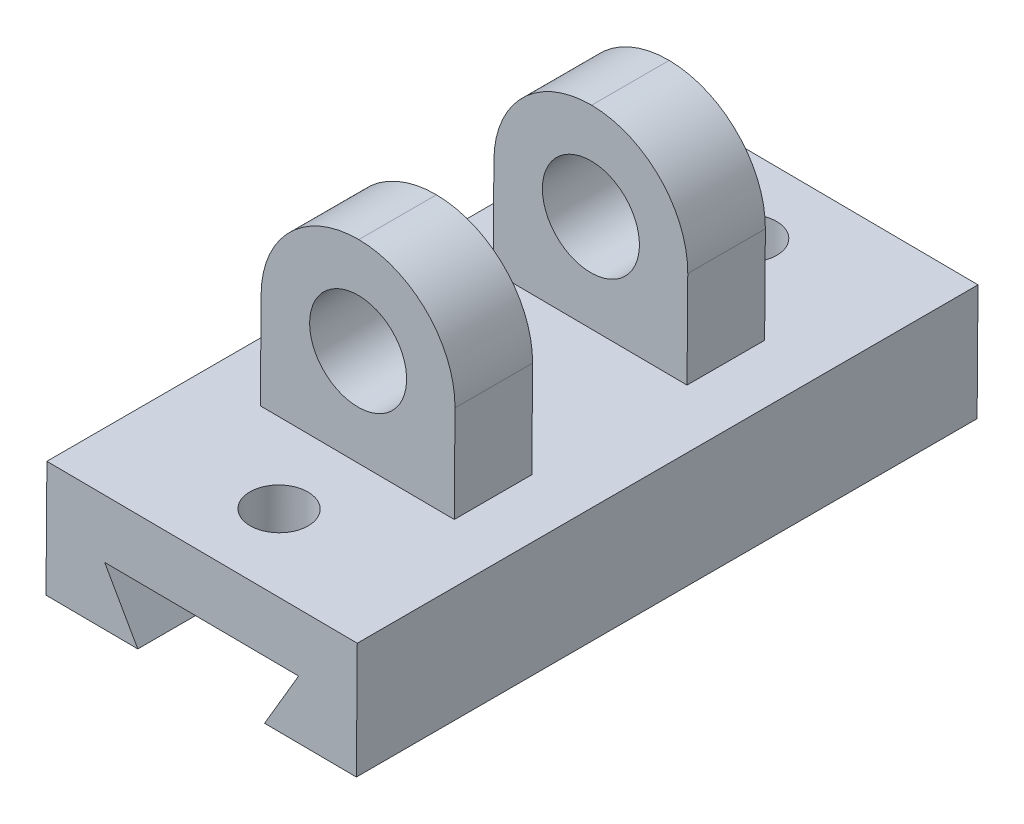
ISO-10303-21;
HEADER;
FILE_DESCRIPTION(('STEP AP214'),'2;1');
FILE_NAME('part.step','',(''),(''),'','','');
FILE_SCHEMA(('AUTOMOTIVE_DESIGN { 1 0 10303 214 1 1 1 1 }'));
ENDSEC;
DATA;
#1=APPLICATION_CONTEXT('core data for automotive mechanical design processes');
#2=APPLICATION_PROTOCOL_DEFINITION('international standard','automotive_design',2000,#1);
#3=PRODUCT_CONTEXT('',#1,'mechanical');
#4=PRODUCT('Part','Part','',(#3));
#5=PRODUCT_RELATED_PRODUCT_CATEGORY('part','',(#4));
#6=PRODUCT_DEFINITION_FORMATION('','',#4);
#7=PRODUCT_DEFINITION_CONTEXT('part definition',#1,'design');
#8=PRODUCT_DEFINITION('design','',#6,#7);
#9=PRODUCT_DEFINITION_SHAPE('','',#8);
#10=(LENGTH_UNIT() NAMED_UNIT(*) SI_UNIT(.MILLI.,.METRE.));
#11=(NAMED_UNIT(*) PLANE_ANGLE_UNIT() SI_UNIT($,.RADIAN.));
#12=(NAMED_UNIT(*) SI_UNIT($,.STERADIAN.) SOLID_ANGLE_UNIT());
#13=UNCERTAINTY_MEASURE_WITH_UNIT(LENGTH_MEASURE(1.E-05),#10,'distance_accuracy_value','');
#14=(GEOMETRIC_REPRESENTATION_CONTEXT(3) GLOBAL_UNCERTAINTY_ASSIGNED_CONTEXT((#13)) GLOBAL_UNIT_ASSIGNED_CONTEXT((#10,
#11,#12)) REPRESENTATION_CONTEXT('',''));
#15=CARTESIAN_POINT('',(0.,0.,0.));
#16=DIRECTION('',(0.,0.,1.));
#17=DIRECTION('',(1.,0.,0.));
#18=AXIS2_PLACEMENT_3D('',#15,#16,#17);
#19=CARTESIAN_POINT('',(-46.1272662721142,8.0110648260031,-160.));
#20=DIRECTION('',(0.00763777532237596,0.99997083176867,0.));
#21=DIRECTION('',(-0.99997083176867,0.00763777532237596,0.));
#22=AXIS2_PLACEMENT_3D('',#19,#20,#21);
#23=PLANE('',#22);
#24=DIRECTION('',(0.99997083176867,-0.00763777532237597,0.));
#25=VECTOR('',#24,1.);
#26=CARTESIAN_POINT('',(-31.0983660773324,7.89627411473093,-40.));
#27=LINE('',#26,#25);
#28=CARTESIAN_POINT('',(-31.0983660773324,7.89627411473093,-40.));
#29=VERTEX_POINT('',#28);
#30=CARTESIAN_POINT('',(18.8731712513557,7.514591607097,-40.));
#31=VERTEX_POINT('',#30);
#32=EDGE_CURVE('E189',#29,#31,#27,.T.);
#33=ORIENTED_EDGE('',*,*,#32,.F.);
#34=DIRECTION('',(0.,0.,1.));
#35=VECTOR('',#34,1.);
#36=CARTESIAN_POINT('',(-31.0983660773324,7.89627411473093,-60.));
#37=LINE('',#36,#35);
#38=CARTESIAN_POINT('',(-31.0983660773324,7.89627411473093,-60.));
#39=VERTEX_POINT('',#38);
#40=EDGE_CURVE('E162',#39,#29,#37,.T.);
#41=ORIENTED_EDGE('',*,*,#40,.F.);
#42=DIRECTION('',(-0.99997083176867,0.00763777532237597,0.));
#43=VECTOR('',#42,1.);
#44=CARTESIAN_POINT('',(-31.0983660773324,7.89627411473093,-60.));
#45=LINE('',#44,#43);
#46=CARTESIAN_POINT('',(18.8731712513555,7.514591607097,-60.));
#47=VERTEX_POINT('',#46);
#48=EDGE_CURVE('E195',#47,#39,#45,.T.);
#49=ORIENTED_EDGE('',*,*,#48,.F.);
#50=DIRECTION('',(0.,0.,-1.));
#51=VECTOR('',#50,1.);
#52=CARTESIAN_POINT('',(18.8731712513557,7.514591607097,-60.));
#53=LINE('',#52,#51);
#54=EDGE_CURVE('E192',#31,#47,#53,.T.);
#55=ORIENTED_EDGE('',*,*,#54,.F.);
#56=EDGE_LOOP('',(#33,#41,#49,#55));
#57=FACE_BOUND('',#56,.T.);
#58=CARTESIAN_POINT('',(-5.89384717139153,7.70376204698225,-19.602368066387));
#59=DIRECTION('',(0.00763777532237596,0.99997083176867,0.));
#60=DIRECTION('',(-0.99997083176867,0.00763777532237596,0.));
#61=AXIS2_PLACEMENT_3D('',#58,#59,#60);
#62=CIRCLE('',#61,7.5);
#63=CARTESIAN_POINT('',(-13.3936284096565,7.76104536190007,-19.602368066387));
#64=VERTEX_POINT('',#63);
#65=EDGE_CURVE('E206',#64,#64,#62,.T.);
#66=ORIENTED_EDGE('',*,*,#65,.F.);
#67=EDGE_LOOP('',(#66));
#68=FACE_BOUND('',#67,.T.);
#69=DIRECTION('',(-0.99997083176867,0.00763777532237596,0.));
#70=VECTOR('',#69,1.);
#71=CARTESIAN_POINT('',(-46.1272662721142,8.0110648260031,0.));
#72=LINE('',#71,#70);
#73=CARTESIAN_POINT('',(33.8727337278858,7.40002497726136,0.));
#74=VERTEX_POINT('',#73);
#75=CARTESIAN_POINT('',(-46.1272662721142,8.0110648260031,0.));
#76=VERTEX_POINT('',#75);
#77=EDGE_CURVE('E218',#74,#76,#72,.T.);
#78=ORIENTED_EDGE('',*,*,#77,.F.);
#79=DIRECTION('',(0.,0.,1.));
#80=VECTOR('',#79,1.);
#81=CARTESIAN_POINT('',(33.8727337278858,7.40002497726136,-160.));
#82=LINE('',#81,#80);
#83=CARTESIAN_POINT('',(33.8727337278858,7.40002497726136,-160.));
#84=VERTEX_POINT('',#83);
#85=EDGE_CURVE('E266',#84,#74,#82,.T.);
#86=ORIENTED_EDGE('',*,*,#85,.F.);
#87=DIRECTION('',(-0.99997083176867,0.00763777532237596,0.));
#88=VECTOR('',#87,1.);
#89=CARTESIAN_POINT('',(-46.1272662721142,8.0110648260031,-160.));
#90=LINE('',#89,#88);
#91=CARTESIAN_POINT('',(-46.1272662721142,8.0110648260031,-160.));
#92=VERTEX_POINT('',#91);
#93=EDGE_CURVE('E236',#84,#92,#90,.T.);
#94=ORIENTED_EDGE('',*,*,#93,.T.);
#95=DIRECTION('',(0.,0.,1.));
#96=VECTOR('',#95,1.);
#97=CARTESIAN_POINT('',(-46.1272662721142,8.0110648260031,-160.));
#98=LINE('',#97,#96);
#99=EDGE_CURVE('E263',#92,#76,#98,.T.);
#100=ORIENTED_EDGE('',*,*,#99,.T.);
#101=EDGE_LOOP('',(#78,#86,#94,#100));
#102=FACE_BOUND('',#101,.T.);
#103=CARTESIAN_POINT('',(-5.89384717139153,7.70376204698225,-140.397631933613));
#104=DIRECTION('',(-0.00763777532237596,-0.99997083176867,0.));
#105=DIRECTION('',(0.99997083176867,-0.00763777532237596,0.));
#106=AXIS2_PLACEMENT_3D('',#103,#104,#105);
#107=CIRCLE('',#106,7.5);
#108=CARTESIAN_POINT('',(-13.3936284096565,7.76104536190007,-140.397631933613));
#109=VERTEX_POINT('',#108);
#110=EDGE_CURVE('E210',#109,#109,#107,.T.);
#111=ORIENTED_EDGE('',*,*,#110,.T.);
#112=EDGE_LOOP('',(#111));
#113=FACE_BOUND('',#112,.T.);
#114=DIRECTION('',(0.,0.,-1.));
#115=VECTOR('',#114,1.);
#116=CARTESIAN_POINT('',(18.8731712513557,7.514591607097,-100.));
#117=LINE('',#116,#115);
#118=CARTESIAN_POINT('',(18.8731712513557,7.514591607097,-100.));
#119=VERTEX_POINT('',#118);
#120=CARTESIAN_POINT('',(18.8731712513557,7.514591607097,-120.));
#121=VERTEX_POINT('',#120);
#122=EDGE_CURVE('E158',#119,#121,#117,.T.);
#123=ORIENTED_EDGE('',*,*,#122,.F.);
#124=DIRECTION('',(0.99997083176867,-0.00763777532237597,0.));
#125=VECTOR('',#124,1.);
#126=CARTESIAN_POINT('',(-31.0983660773324,7.89627411473093,-100.));
#127=LINE('',#126,#125);
#128=CARTESIAN_POINT('',(-31.0983660773324,7.89627411473093,-100.));
#129=VERTEX_POINT('',#128);
#130=EDGE_CURVE('E166',#129,#119,#127,.T.);
#131=ORIENTED_EDGE('',*,*,#130,.F.);
#132=DIRECTION('',(0.,0.,1.));
#133=VECTOR('',#132,1.);
#134=CARTESIAN_POINT('',(-31.0983660773324,7.89627411473093,-100.));
#135=LINE('',#134,#133);
#136=CARTESIAN_POINT('',(-31.0983660773324,7.89627411473092,-120.));
#137=VERTEX_POINT('',#136);
#138=EDGE_CURVE('E178',#137,#129,#135,.T.);
#139=ORIENTED_EDGE('',*,*,#138,.F.);
#140=DIRECTION('',(-0.99997083176867,0.00763777532237597,0.));
#141=VECTOR('',#140,1.);
#142=CARTESIAN_POINT('',(-31.0983660773324,7.89627411473093,-120.));
#143=LINE('',#142,#141);
#144=EDGE_CURVE('E176',#121,#137,#143,.T.);
#145=ORIENTED_EDGE('',*,*,#144,.F.);
#146=EDGE_LOOP('',(#123,#131,#139,#145));
#147=FACE_BOUND('',#146,.T.);
#148=ADVANCED_FACE('F33',(#57,#68,#102,#113,#147),#23,.T.);
#149=CARTESIAN_POINT('',(-31.2422704254198,-7.10306428036258,-160.));
#150=DIRECTION('',(-0.00763777532237572,-0.99997083176867,0.));
#151=DIRECTION('',(0.99997083176867,-0.00763777532237572,0.));
#152=AXIS2_PLACEMENT_3D('',#149,#150,#151);
#153=PLANE('',#152);
#154=CARTESIAN_POINT('',(-6.00841380122716,-7.29580042954778,-19.602368066387));
#155=DIRECTION('',(-0.00763777532237572,-0.99997083176867,0.));
#156=DIRECTION('',(0.99997083176867,-0.00763777532237572,0.));
#157=AXIS2_PLACEMENT_3D('',#154,#155,#156);
#158=CIRCLE('',#157,7.5);
#159=CARTESIAN_POINT('',(-13.5081950394922,-7.23851711462997,-19.602368066387));
#160=VERTEX_POINT('',#159);
#161=EDGE_CURVE('E209',#160,#160,#158,.T.);
#162=ORIENTED_EDGE('',*,*,#161,.F.);
#163=EDGE_LOOP('',(#162));
#164=FACE_BOUND('',#163,.T.);
#165=DIRECTION('',(0.99997083176867,-0.00763777532237572,0.));
#166=VECTOR('',#165,1.);
#167=CARTESIAN_POINT('',(-31.2422704254198,-7.10306428036258,0.));
#168=LINE('',#167,#166);
#169=CARTESIAN_POINT('',(-31.2422704254198,-7.10306428036258,0.));
#170=VERTEX_POINT('',#169);
#171=CARTESIAN_POINT('',(18.7586046215201,-7.48497086943303,0.));
#172=VERTEX_POINT('',#171);
#173=EDGE_CURVE('E249',#170,#172,#168,.T.);
#174=ORIENTED_EDGE('',*,*,#173,.F.);
#175=DIRECTION('',(0.,0.,1.));
#176=VECTOR('',#175,1.);
#177=CARTESIAN_POINT('',(-31.2422704254198,-7.10306428036258,-160.));
#178=LINE('',#177,#176);
#179=CARTESIAN_POINT('',(-31.2422704254198,-7.10306428036258,-160.));
#180=VERTEX_POINT('',#179);
#181=EDGE_CURVE('E274',#180,#170,#178,.T.);
#182=ORIENTED_EDGE('',*,*,#181,.F.);
#183=DIRECTION('',(0.99997083176867,-0.00763777532237572,0.));
#184=VECTOR('',#183,1.);
#185=CARTESIAN_POINT('',(-31.2422704254198,-7.10306428036258,-160.));
#186=LINE('',#185,#184);
#187=CARTESIAN_POINT('',(18.7586046215201,-7.48497086943303,-160.));
#188=VERTEX_POINT('',#187);
#189=EDGE_CURVE('E224',#180,#188,#186,.T.);
#190=ORIENTED_EDGE('',*,*,#189,.T.);
#191=DIRECTION('',(0.,0.,1.));
#192=VECTOR('',#191,1.);
#193=CARTESIAN_POINT('',(18.7586046215201,-7.48497086943303,-160.));
#194=LINE('',#193,#192);
#195=EDGE_CURVE('E272',#188,#172,#194,.T.);
#196=ORIENTED_EDGE('',*,*,#195,.T.);
#197=EDGE_LOOP('',(#174,#182,#190,#196));
#198=FACE_BOUND('',#197,.T.);
#199=CARTESIAN_POINT('',(-6.00841380122716,-7.29580042954778,-140.397631933613));
#200=DIRECTION('',(-0.00763777532237572,-0.99997083176867,0.));
#201=DIRECTION('',(0.99997083176867,-0.00763777532237572,0.));
#202=AXIS2_PLACEMENT_3D('',#199,#200,#201);
#203=CIRCLE('',#202,7.5);
#204=CARTESIAN_POINT('',(-13.5081950394922,-7.23851711462997,-140.397631933613));
#205=VERTEX_POINT('',#204);
#206=EDGE_CURVE('E213',#205,#205,#203,.F.);
#207=ORIENTED_EDGE('',*,*,#206,.T.);
#208=EDGE_LOOP('',(#207));
#209=FACE_BOUND('',#208,.T.);
#210=ADVANCED_FACE('F332',(#164,#198,#209),#153,.T.);
#211=CARTESIAN_POINT('',(-46.1272662721142,8.0110648260031,-160.));
#212=DIRECTION('',(-0.99997083176867,0.0076377753223759,0.));
#213=DIRECTION('',(-0.0076377753223759,-0.99997083176867,0.));
#214=AXIS2_PLACEMENT_3D('',#211,#212,#213);
#215=PLANE('',#214);
#216=DIRECTION('',(-0.0076377753223759,-0.99997083176867,0.));
#217=VECTOR('',#216,1.);
#218=CARTESIAN_POINT('',(-46.1272662721142,8.0110648260031,0.));
#219=LINE('',#218,#217);
#220=CARTESIAN_POINT('',(-46.3563995317855,-21.988060127057,0.));
#221=VERTEX_POINT('',#220);
#222=EDGE_CURVE('E240',#76,#221,#219,.T.);
#223=ORIENTED_EDGE('',*,*,#222,.F.);
#224=ORIENTED_EDGE('',*,*,#99,.F.);
#225=DIRECTION('',(-0.0076377753223759,-0.99997083176867,0.));
#226=VECTOR('',#225,1.);
#227=CARTESIAN_POINT('',(-46.1272662721142,8.0110648260031,-160.));
#228=LINE('',#227,#226);
#229=CARTESIAN_POINT('',(-46.3563995317855,-21.988060127057,-160.));
#230=VERTEX_POINT('',#229);
#231=EDGE_CURVE('E214',#92,#230,#228,.T.);
#232=ORIENTED_EDGE('',*,*,#231,.T.);
#233=DIRECTION('',(0.,0.,1.));
#234=VECTOR('',#233,1.);
#235=CARTESIAN_POINT('',(-46.3563995317855,-21.988060127057,-160.));
#236=LINE('',#235,#234);
#237=EDGE_CURVE('E239',#230,#221,#236,.T.);
#238=ORIENTED_EDGE('',*,*,#237,.T.);
#239=EDGE_LOOP('',(#223,#224,#232,#238));
#240=FACE_BOUND('',#239,.T.);
#241=ADVANCED_FACE('F338',(#240),#215,.T.);
#242=CARTESIAN_POINT('',(33.8727337278858,7.40002497726136,-160.));
#243=DIRECTION('',(0.99997083176867,-0.00763777532237544,0.));
#244=DIRECTION('',(0.00763777532237544,0.99997083176867,0.));
#245=AXIS2_PLACEMENT_3D('',#242,#243,#244);
#246=PLANE('',#245);
#247=DIRECTION('',(0.00763777532237544,0.99997083176867,0.));
#248=VECTOR('',#247,1.);
#249=CARTESIAN_POINT('',(33.8727337278858,7.40002497726136,0.));
#250=LINE('',#249,#248);
#251=CARTESIAN_POINT('',(33.6436004682145,-22.5990999757987,0.));
#252=VERTEX_POINT('',#251);
#253=EDGE_CURVE('E258',#252,#74,#250,.T.);
#254=ORIENTED_EDGE('',*,*,#253,.F.);
#255=DIRECTION('',(0.,0.,1.));
#256=VECTOR('',#255,1.);
#257=CARTESIAN_POINT('',(33.6436004682145,-22.5990999757987,-160.));
#258=LINE('',#257,#256);
#259=CARTESIAN_POINT('',(33.6436004682145,-22.5990999757987,-160.));
#260=VERTEX_POINT('',#259);
#261=EDGE_CURVE('E268',#260,#252,#258,.T.);
#262=ORIENTED_EDGE('',*,*,#261,.F.);
#263=DIRECTION('',(0.00763777532237544,0.99997083176867,0.));
#264=VECTOR('',#263,1.);
#265=CARTESIAN_POINT('',(33.8727337278858,7.40002497726136,-160.));
#266=LINE('',#265,#264);
#267=EDGE_CURVE('E233',#260,#84,#266,.T.);
#268=ORIENTED_EDGE('',*,*,#267,.T.);
#269=ORIENTED_EDGE('',*,*,#85,.T.);
#270=EDGE_LOOP('',(#254,#262,#268,#269));
#271=FACE_BOUND('',#270,.T.);
#272=ADVANCED_FACE('F347',(#271),#246,.T.);
#273=CARTESIAN_POINT('',(9.98403655813328,-22.4183882713873,-160.));
#274=DIRECTION('',(-0.0076377753223764,-0.99997083176867,0.));
#275=DIRECTION('',(0.99997083176867,-0.0076377753223764,0.));
#276=AXIS2_PLACEMENT_3D('',#273,#274,#275);
#277=PLANE('',#276);
#278=DIRECTION('',(0.99997083176867,-0.0076377753223764,0.));
#279=VECTOR('',#278,1.);
#280=CARTESIAN_POINT('',(9.98403655813328,-22.4183882713873,0.));
#281=LINE('',#280,#279);
#282=CARTESIAN_POINT('',(9.98403655813328,-22.4183882713873,0.));
#283=VERTEX_POINT('',#282);
#284=EDGE_CURVE('E255',#283,#252,#281,.T.);
#285=ORIENTED_EDGE('',*,*,#284,.F.);
#286=DIRECTION('',(0.,0.,1.));
#287=VECTOR('',#286,1.);
#288=CARTESIAN_POINT('',(9.98403655813328,-22.4183882713873,-160.));
#289=LINE('',#288,#287);
#290=CARTESIAN_POINT('',(9.98403655813328,-22.4183882713873,-160.));
#291=VERTEX_POINT('',#290);
#292=EDGE_CURVE('E270',#291,#283,#289,.T.);
#293=ORIENTED_EDGE('',*,*,#292,.F.);
#294=DIRECTION('',(0.99997083176867,-0.0076377753223764,0.));
#295=VECTOR('',#294,1.);
#296=CARTESIAN_POINT('',(9.98403655813328,-22.4183882713873,-160.));
#297=LINE('',#296,#295);
#298=EDGE_CURVE('E230',#291,#260,#297,.T.);
#299=ORIENTED_EDGE('',*,*,#298,.T.);
#300=ORIENTED_EDGE('',*,*,#261,.T.);
#301=EDGE_LOOP('',(#285,#293,#299,#300));
#302=FACE_BOUND('',#301,.T.);
#303=ADVANCED_FACE('F350',(#302),#277,.T.);
#304=CARTESIAN_POINT('',(18.7586046215201,-7.48497086943303,-160.));
#305=DIRECTION('',(-0.862181255693936,0.506599923341908,0.));
#306=DIRECTION('',(-0.506599923341908,-0.862181255693936,0.));
#307=AXIS2_PLACEMENT_3D('',#304,#305,#306);
#308=PLANE('',#307);
#309=DIRECTION('',(-0.506599923341908,-0.862181255693936,0.));
#310=VECTOR('',#309,1.);
#311=CARTESIAN_POINT('',(18.7586046215201,-7.48497086943303,0.));
#312=LINE('',#311,#310);
#313=EDGE_CURVE('E252',#172,#283,#312,.T.);
#314=ORIENTED_EDGE('',*,*,#313,.F.);
#315=ORIENTED_EDGE('',*,*,#195,.F.);
#316=DIRECTION('',(-0.506599923341908,-0.862181255693936,0.));
#317=VECTOR('',#316,1.);
#318=CARTESIAN_POINT('',(18.7586046215201,-7.48497086943303,-160.));
#319=LINE('',#318,#317);
#320=EDGE_CURVE('E227',#188,#291,#319,.T.);
#321=ORIENTED_EDGE('',*,*,#320,.T.);
#322=ORIENTED_EDGE('',*,*,#292,.T.);
#323=EDGE_LOOP('',(#314,#315,#321,#322));
#324=FACE_BOUND('',#323,.T.);
#325=ADVANCED_FACE('F354',(#324),#308,.T.);
#326=CARTESIAN_POINT('',(-31.2422704254198,-7.10306428036258,-160.));
#327=DIRECTION('',(0.869819031016312,0.493370908426758,0.));
#328=DIRECTION('',(-0.493370908426758,0.869819031016312,0.));
#329=AXIS2_PLACEMENT_3D('',#326,#327,#328);
#330=PLANE('',#329);
#331=DIRECTION('',(-0.493370908426758,0.869819031016312,0.));
#332=VECTOR('',#331,1.);
#333=CARTESIAN_POINT('',(-31.2422704254198,-7.10306428036258,0.));
#334=LINE('',#333,#332);
#335=CARTESIAN_POINT('',(-22.6968356217043,-22.1687718314684,0.));
#336=VERTEX_POINT('',#335);
#337=EDGE_CURVE('E246',#336,#170,#334,.T.);
#338=ORIENTED_EDGE('',*,*,#337,.F.);
#339=DIRECTION('',(0.,0.,1.));
#340=VECTOR('',#339,1.);
#341=CARTESIAN_POINT('',(-22.6968356217043,-22.1687718314684,-160.));
#342=LINE('',#341,#340);
#343=CARTESIAN_POINT('',(-22.6968356217043,-22.1687718314684,-160.));
#344=VERTEX_POINT('',#343);
#345=EDGE_CURVE('E276',#344,#336,#342,.T.);
#346=ORIENTED_EDGE('',*,*,#345,.F.);
#347=DIRECTION('',(-0.493370908426758,0.869819031016312,0.));
#348=VECTOR('',#347,1.);
#349=CARTESIAN_POINT('',(-31.2422704254198,-7.10306428036258,-160.));
#350=LINE('',#349,#348);
#351=EDGE_CURVE('E221',#344,#180,#350,.T.);
#352=ORIENTED_EDGE('',*,*,#351,.T.);
#353=ORIENTED_EDGE('',*,*,#181,.T.);
#354=EDGE_LOOP('',(#338,#346,#352,#353));
#355=FACE_BOUND('',#354,.T.);
#356=ADVANCED_FACE('F357',(#355),#330,.T.);
#357=CARTESIAN_POINT('',(-46.3563995317855,-21.988060127057,-160.));
#358=DIRECTION('',(-0.00763777532237582,-0.99997083176867,0.));
#359=DIRECTION('',(0.99997083176867,-0.00763777532237582,0.));
#360=AXIS2_PLACEMENT_3D('',#357,#358,#359);
#361=PLANE('',#360);
#362=DIRECTION('',(0.99997083176867,-0.00763777532237582,0.));
#363=VECTOR('',#362,1.);
#364=CARTESIAN_POINT('',(-46.3563995317855,-21.988060127057,0.));
#365=LINE('',#364,#363);
#366=EDGE_CURVE('E243',#221,#336,#365,.T.);
#367=ORIENTED_EDGE('',*,*,#366,.F.);
#368=ORIENTED_EDGE('',*,*,#237,.F.);
#369=DIRECTION('',(0.99997083176867,-0.00763777532237582,0.));
#370=VECTOR('',#369,1.);
#371=CARTESIAN_POINT('',(-46.3563995317855,-21.988060127057,-160.));
#372=LINE('',#371,#370);
#373=EDGE_CURVE('E217',#230,#344,#372,.T.);
#374=ORIENTED_EDGE('',*,*,#373,.T.);
#375=ORIENTED_EDGE('',*,*,#345,.T.);
#376=EDGE_LOOP('',(#367,#368,#374,#375));
#377=FACE_BOUND('',#376,.T.);
#378=ADVANCED_FACE('F362',(#377),#361,.T.);
#379=CARTESIAN_POINT('',(0.,0.,-160.));
#380=DIRECTION('',(0.,0.,1.));
#381=DIRECTION('',(1.,0.,0.));
#382=AXIS2_PLACEMENT_3D('',#379,#380,#381);
#383=PLANE('',#382);
#384=ORIENTED_EDGE('',*,*,#231,.F.);
#385=ORIENTED_EDGE('',*,*,#93,.F.);
#386=ORIENTED_EDGE('',*,*,#267,.F.);
#387=ORIENTED_EDGE('',*,*,#298,.F.);
#388=ORIENTED_EDGE('',*,*,#320,.F.);
#389=ORIENTED_EDGE('',*,*,#189,.F.);
#390=ORIENTED_EDGE('',*,*,#351,.F.);
#391=ORIENTED_EDGE('',*,*,#373,.F.);
#392=EDGE_LOOP('',(#384,#385,#386,#387,#388,#389,#390,#391));
#393=FACE_BOUND('',#392,.T.);
#394=ADVANCED_FACE('F366',(#393),#383,.F.);
#395=CARTESIAN_POINT('',(0.,0.,0.));
#396=DIRECTION('',(0.,0.,1.));
#397=DIRECTION('',(1.,0.,0.));
#398=AXIS2_PLACEMENT_3D('',#395,#396,#397);
#399=PLANE('',#398);
#400=ORIENTED_EDGE('',*,*,#222,.T.);
#401=ORIENTED_EDGE('',*,*,#366,.T.);
#402=ORIENTED_EDGE('',*,*,#337,.T.);
#403=ORIENTED_EDGE('',*,*,#173,.T.);
#404=ORIENTED_EDGE('',*,*,#313,.T.);
#405=ORIENTED_EDGE('',*,*,#284,.T.);
#406=ORIENTED_EDGE('',*,*,#253,.T.);
#407=ORIENTED_EDGE('',*,*,#77,.T.);
#408=EDGE_LOOP('',(#400,#401,#402,#403,#404,#405,#406,#407));
#409=FACE_BOUND('',#408,.T.);
#410=ADVANCED_FACE('F345',(#409),#399,.T.);
#411=CARTESIAN_POINT('',(-6.17644485831944,-29.2951587284585,-140.397631933613));
#412=DIRECTION('',(0.00763777532237596,0.99997083176867,0.));
#413=DIRECTION('',(-0.99997083176867,0.00763777532237597,0.));
#414=AXIS2_PLACEMENT_3D('',#411,#412,#413);
#415=CYLINDRICAL_SURFACE('',#414,7.5);
#416=CARTESIAN_POINT('',(-13.5081950394922,-7.23851711462997,-140.397631933613));
#417=CARTESIAN_POINT('',(-13.5070016370981,-7.08227167216611,-140.397631933613));
#418=CARTESIAN_POINT('',(-13.5058082347039,-6.92602622970226,-140.397631933613));
#419=CARTESIAN_POINT('',(-13.5034214299157,-6.61353534477455,-140.397631933613));
#420=CARTESIAN_POINT('',(-13.5022280275216,-6.4572899023107,-140.397631933613));
#421=CARTESIAN_POINT('',(-13.4998412227333,-6.14479901738299,-140.397631933613));
#422=CARTESIAN_POINT('',(-13.4986478203392,-5.98855357491913,-140.397631933613));
#423=CARTESIAN_POINT('',(-13.496261015551,-5.67606268999143,-140.397631933613));
#424=CARTESIAN_POINT('',(-13.4950676131568,-5.51981724752757,-140.397631933613));
#425=CARTESIAN_POINT('',(-13.4926808083686,-5.20732636259986,-140.397631933613));
#426=CARTESIAN_POINT('',(-13.4914874059745,-5.05108092013601,-140.397631933613));
#427=CARTESIAN_POINT('',(-13.4891006011862,-4.7385900352083,-140.397631933613));
#428=CARTESIAN_POINT('',(-13.4879071987921,-4.58234459274444,-140.397631933613));
#429=CARTESIAN_POINT('',(-13.4855203940039,-4.26985370781673,-140.397631933613));
#430=CARTESIAN_POINT('',(-13.4843269916098,-4.11360826535288,-140.397631933613));
#431=CARTESIAN_POINT('',(-13.4819401868215,-3.80111738042517,-140.397631933613));
#432=CARTESIAN_POINT('',(-13.4807467844274,-3.64487193796132,-140.397631933613));
#433=CARTESIAN_POINT('',(-13.4783599796392,-3.33238105303361,-140.397631933613));
#434=CARTESIAN_POINT('',(-13.477166577245,-3.17613561056975,-140.397631933613));
#435=CARTESIAN_POINT('',(-13.4747797724568,-2.86364472564204,-140.397631933613));
#436=CARTESIAN_POINT('',(-13.4735863700627,-2.70739928317819,-140.397631933613));
#437=CARTESIAN_POINT('',(-13.4711995652744,-2.39490839825048,-140.397631933613));
#438=CARTESIAN_POINT('',(-13.4700061628803,-2.23866295578662,-140.397631933613));
#439=CARTESIAN_POINT('',(-13.4676193580921,-1.92617207085892,-140.397631933613));
#440=CARTESIAN_POINT('',(-13.4664259556979,-1.76992662839506,-140.397631933613));
#441=CARTESIAN_POINT('',(-13.4640391509097,-1.45743574346735,-140.397631933613));
#442=CARTESIAN_POINT('',(-13.4628457485156,-1.3011903010035,-140.397631933613));
#443=CARTESIAN_POINT('',(-13.4604589437273,-0.988699416075789,-140.397631933613));
#444=CARTESIAN_POINT('',(-13.4592655413332,-0.832453973611933,-140.397631933613));
#445=CARTESIAN_POINT('',(-13.456878736545,-0.519963088684224,-140.397631933613));
#446=CARTESIAN_POINT('',(-13.4556853341508,-0.36371764622037,-140.397631933613));
#447=CARTESIAN_POINT('',(-13.4532985293626,-0.0512267612926612,-140.397631933613));
#448=CARTESIAN_POINT('',(-13.4521051269685,0.105018681171193,-140.397631933613));
#449=CARTESIAN_POINT('',(-13.4497183221802,0.417509566098903,-140.397631933613));
#450=CARTESIAN_POINT('',(-13.4485249197861,0.573755008562758,-140.397631933613));
#451=CARTESIAN_POINT('',(-13.4461381149979,0.886245893490466,-140.397631933613));
#452=CARTESIAN_POINT('',(-13.4449447126038,1.04249133595432,-140.397631933613));
#453=CARTESIAN_POINT('',(-13.4425579078155,1.35498222088203,-140.397631933613));
#454=CARTESIAN_POINT('',(-13.4413645054214,1.51122766334589,-140.397631933613));
#455=CARTESIAN_POINT('',(-13.4389777006331,1.8237185482736,-140.397631933613));
#456=CARTESIAN_POINT('',(-13.437784298239,1.97996399073745,-140.397631933613));
#457=CARTESIAN_POINT('',(-13.4353974934508,2.29245487566516,-140.397631933613));
#458=CARTESIAN_POINT('',(-13.4342040910567,2.44870031812901,-140.397631933613));
#459=CARTESIAN_POINT('',(-13.4318172862684,2.76119120305672,-140.397631933613));
#460=CARTESIAN_POINT('',(-13.4306238838743,2.91743664552057,-140.397631933613));
#461=CARTESIAN_POINT('',(-13.4282370790861,3.22992753044828,-140.397631933613));
#462=CARTESIAN_POINT('',(-13.4270436766919,3.38617297291213,-140.397631933613));
#463=CARTESIAN_POINT('',(-13.4246568719037,3.69866385783985,-140.397631933613));
#464=CARTESIAN_POINT('',(-13.4234634695096,3.8549093003037,-140.397631933613));
#465=CARTESIAN_POINT('',(-13.4210766647213,4.16740018523141,-140.397631933613));
#466=CARTESIAN_POINT('',(-13.4198832623272,4.32364562769527,-140.397631933613));
#467=CARTESIAN_POINT('',(-13.417496457539,4.63613651262298,-140.397631933613));
#468=CARTESIAN_POINT('',(-13.4163030551448,4.79238195508683,-140.397631933613));
#469=CARTESIAN_POINT('',(-13.4139162503566,5.10487284001454,-140.397631933613));
#470=CARTESIAN_POINT('',(-13.4127228479625,5.26111828247839,-140.397631933613));
#471=CARTESIAN_POINT('',(-13.4103360431742,5.5736091674061,-140.397631933613));
#472=CARTESIAN_POINT('',(-13.4091426407801,5.72985460986995,-140.397631933613));
#473=CARTESIAN_POINT('',(-13.4067558359919,6.04234549479767,-140.397631933613));
#474=CARTESIAN_POINT('',(-13.4055624335978,6.19859093726152,-140.397631933613));
#475=CARTESIAN_POINT('',(-13.4031756288095,6.51108182218923,-140.397631933613));
#476=CARTESIAN_POINT('',(-13.4019822264154,6.66732726465308,-140.397631933613));
#477=CARTESIAN_POINT('',(-13.3995954216271,6.97981814958079,-140.397631933613));
#478=CARTESIAN_POINT('',(-13.398402019233,7.13606359204464,-140.397631933613));
#479=CARTESIAN_POINT('',(-13.3960152144448,7.44855447697235,-140.397631933613));
#480=CARTESIAN_POINT('',(-13.3948218120507,7.60479991943621,-140.397631933613));
#481=CARTESIAN_POINT('',(-13.3936284096565,7.76104536190007,-140.397631933613));
#482=B_SPLINE_CURVE_WITH_KNOTS('',3,(#416,#417,#418,#419,#420,#421,#422,#423,#424,#425,#426,
#427,#428,#429,#430,#431,#432,#433,#434,#435,#436,#437,#438,#439,#440,#441,#442,#443,#444,#445,
#446,#447,#448,#449,#450,#451,#452,#453,#454,#455,#456,#457,#458,#459,#460,#461,#462,#463,#464,
#465,#466,#467,#468,#469,#470,#471,#472,#473,#474,#475,#476,#477,#478,#479,#480,#481),
.UNSPECIFIED.,.F.,.F.,(4,2,2,2,2,2,2,2,2,2,2,2,2,2,2,2,2,2,2,2,2,2,2,2,2,2,2,2,2,2,2,2,4),(0.,
0.468749999999999,0.937500000000001,1.40625,1.875,2.34375,2.8125,3.28125,3.74999999999999,
4.21875,4.68749999999999,5.15625,5.625,6.09374999999999,6.5625,7.03124999999999,
7.49999999999999,7.96875,8.43749999999999,8.90625,9.37499999999999,9.84374999999999,10.3125,
10.78125,11.25,11.71875,12.1875,12.65625,13.125,13.59375,14.0625,14.53125,15.),.UNSPECIFIED.);
#483=EDGE_CURVE('BSEAM443',#205,#109,#482,.T.);
#484=ORIENTED_EDGE('',*,*,#206,.F.);
#485=ORIENTED_EDGE('',*,*,#110,.F.);
#486=ORIENTED_EDGE('',*,*,#483,.T.);
#487=ORIENTED_EDGE('',*,*,#483,.F.);
#488=EDGE_LOOP('',(#484,#486,#485,#487));
#489=FACE_BOUND('',#488,.T.);
#490=ADVANCED_FACE('F443',(#489),#415,.F.);
#491=CARTESIAN_POINT('',(-6.17644485831944,-29.2951587284585,-19.602368066387));
#492=DIRECTION('',(0.00763777532237596,0.99997083176867,0.));
#493=DIRECTION('',(-0.99997083176867,0.00763777532237597,0.));
#494=AXIS2_PLACEMENT_3D('',#491,#492,#493);
#495=CYLINDRICAL_SURFACE('',#494,7.5);
#496=CARTESIAN_POINT('',(-13.5081950394922,-7.23851711462997,-19.602368066387));
#497=CARTESIAN_POINT('',(-13.5070016370981,-7.08227167216611,-19.602368066387));
#498=CARTESIAN_POINT('',(-13.5058082347039,-6.92602622970226,-19.602368066387));
#499=CARTESIAN_POINT('',(-13.5034214299157,-6.61353534477455,-19.602368066387));
#500=CARTESIAN_POINT('',(-13.5022280275216,-6.4572899023107,-19.602368066387));
#501=CARTESIAN_POINT('',(-13.4998412227333,-6.14479901738299,-19.602368066387));
#502=CARTESIAN_POINT('',(-13.4986478203392,-5.98855357491913,-19.602368066387));
#503=CARTESIAN_POINT('',(-13.496261015551,-5.67606268999143,-19.602368066387));
#504=CARTESIAN_POINT('',(-13.4950676131569,-5.51981724752757,-19.602368066387));
#505=CARTESIAN_POINT('',(-13.4926808083686,-5.20732636259986,-19.602368066387));
#506=CARTESIAN_POINT('',(-13.4914874059745,-5.05108092013601,-19.602368066387));
#507=CARTESIAN_POINT('',(-13.4891006011862,-4.7385900352083,-19.602368066387));
#508=CARTESIAN_POINT('',(-13.4879071987921,-4.58234459274444,-19.602368066387));
#509=CARTESIAN_POINT('',(-13.4855203940039,-4.26985370781673,-19.602368066387));
#510=CARTESIAN_POINT('',(-13.4843269916098,-4.11360826535288,-19.602368066387));
#511=CARTESIAN_POINT('',(-13.4819401868215,-3.80111738042517,-19.602368066387));
#512=CARTESIAN_POINT('',(-13.4807467844274,-3.64487193796132,-19.602368066387));
#513=CARTESIAN_POINT('',(-13.4783599796392,-3.33238105303361,-19.602368066387));
#514=CARTESIAN_POINT('',(-13.477166577245,-3.17613561056975,-19.602368066387));
#515=CARTESIAN_POINT('',(-13.4747797724568,-2.86364472564204,-19.602368066387));
#516=CARTESIAN_POINT('',(-13.4735863700627,-2.70739928317819,-19.602368066387));
#517=CARTESIAN_POINT('',(-13.4711995652744,-2.39490839825048,-19.602368066387));
#518=CARTESIAN_POINT('',(-13.4700061628803,-2.23866295578662,-19.602368066387));
#519=CARTESIAN_POINT('',(-13.4676193580921,-1.92617207085892,-19.602368066387));
#520=CARTESIAN_POINT('',(-13.4664259556979,-1.76992662839506,-19.602368066387));
#521=CARTESIAN_POINT('',(-13.4640391509097,-1.45743574346735,-19.602368066387));
#522=CARTESIAN_POINT('',(-13.4628457485156,-1.3011903010035,-19.602368066387));
#523=CARTESIAN_POINT('',(-13.4604589437273,-0.988699416075789,-19.602368066387));
#524=CARTESIAN_POINT('',(-13.4592655413332,-0.832453973611933,-19.602368066387));
#525=CARTESIAN_POINT('',(-13.456878736545,-0.519963088684224,-19.602368066387));
#526=CARTESIAN_POINT('',(-13.4556853341509,-0.36371764622037,-19.602368066387));
#527=CARTESIAN_POINT('',(-13.4532985293626,-0.0512267612926612,-19.602368066387));
#528=CARTESIAN_POINT('',(-13.4521051269685,0.105018681171193,-19.602368066387));
#529=CARTESIAN_POINT('',(-13.4497183221802,0.417509566098903,-19.602368066387));
#530=CARTESIAN_POINT('',(-13.4485249197861,0.573755008562758,-19.602368066387));
#531=CARTESIAN_POINT('',(-13.4461381149979,0.886245893490466,-19.602368066387));
#532=CARTESIAN_POINT('',(-13.4449447126038,1.04249133595432,-19.602368066387));
#533=CARTESIAN_POINT('',(-13.4425579078155,1.35498222088203,-19.602368066387));
#534=CARTESIAN_POINT('',(-13.4413645054214,1.51122766334589,-19.602368066387));
#535=CARTESIAN_POINT('',(-13.4389777006332,1.8237185482736,-19.602368066387));
#536=CARTESIAN_POINT('',(-13.437784298239,1.97996399073745,-19.602368066387));
#537=CARTESIAN_POINT('',(-13.4353974934508,2.29245487566516,-19.602368066387));
#538=CARTESIAN_POINT('',(-13.4342040910567,2.44870031812901,-19.602368066387));
#539=CARTESIAN_POINT('',(-13.4318172862684,2.76119120305672,-19.602368066387));
#540=CARTESIAN_POINT('',(-13.4306238838743,2.91743664552057,-19.602368066387));
#541=CARTESIAN_POINT('',(-13.4282370790861,3.22992753044828,-19.602368066387));
#542=CARTESIAN_POINT('',(-13.4270436766919,3.38617297291213,-19.602368066387));
#543=CARTESIAN_POINT('',(-13.4246568719037,3.69866385783985,-19.602368066387));
#544=CARTESIAN_POINT('',(-13.4234634695096,3.8549093003037,-19.602368066387));
#545=CARTESIAN_POINT('',(-13.4210766647213,4.16740018523141,-19.602368066387));
#546=CARTESIAN_POINT('',(-13.4198832623272,4.32364562769527,-19.602368066387));
#547=CARTESIAN_POINT('',(-13.417496457539,4.63613651262298,-19.602368066387));
#548=CARTESIAN_POINT('',(-13.4163030551449,4.79238195508683,-19.602368066387));
#549=CARTESIAN_POINT('',(-13.4139162503566,5.10487284001454,-19.602368066387));
#550=CARTESIAN_POINT('',(-13.4127228479625,5.26111828247839,-19.602368066387));
#551=CARTESIAN_POINT('',(-13.4103360431742,5.5736091674061,-19.602368066387));
#552=CARTESIAN_POINT('',(-13.4091426407801,5.72985460986995,-19.602368066387));
#553=CARTESIAN_POINT('',(-13.4067558359919,6.04234549479767,-19.602368066387));
#554=CARTESIAN_POINT('',(-13.4055624335978,6.19859093726152,-19.602368066387));
#555=CARTESIAN_POINT('',(-13.4031756288095,6.51108182218923,-19.602368066387));
#556=CARTESIAN_POINT('',(-13.4019822264154,6.66732726465308,-19.602368066387));
#557=CARTESIAN_POINT('',(-13.3995954216272,6.97981814958079,-19.602368066387));
#558=CARTESIAN_POINT('',(-13.398402019233,7.13606359204464,-19.602368066387));
#559=CARTESIAN_POINT('',(-13.3960152144448,7.44855447697235,-19.602368066387));
#560=CARTESIAN_POINT('',(-13.3948218120507,7.60479991943621,-19.602368066387));
#561=CARTESIAN_POINT('',(-13.3936284096565,7.76104536190007,-19.602368066387));
#562=B_SPLINE_CURVE_WITH_KNOTS('',3,(#496,#497,#498,#499,#500,#501,#502,#503,#504,#505,#506,
#507,#508,#509,#510,#511,#512,#513,#514,#515,#516,#517,#518,#519,#520,#521,#522,#523,#524,#525,
#526,#527,#528,#529,#530,#531,#532,#533,#534,#535,#536,#537,#538,#539,#540,#541,#542,#543,#544,
#545,#546,#547,#548,#549,#550,#551,#552,#553,#554,#555,#556,#557,#558,#559,#560,#561),
.UNSPECIFIED.,.F.,.F.,(4,2,2,2,2,2,2,2,2,2,2,2,2,2,2,2,2,2,2,2,2,2,2,2,2,2,2,2,2,2,2,2,4),(0.,
0.468749999999999,0.937500000000001,1.40625,1.875,2.34375,2.8125,3.28125,3.74999999999999,
4.21875,4.68749999999999,5.15625,5.625,6.09374999999999,6.5625,7.03124999999999,
7.49999999999999,7.96875,8.43749999999999,8.90625,9.37499999999999,9.84374999999999,10.3125,
10.78125,11.25,11.71875,12.1875,12.65625,13.125,13.59375,14.0625,14.53125,15.),.UNSPECIFIED.);
#563=EDGE_CURVE('BSEAM440',#160,#64,#562,.T.);
#564=ORIENTED_EDGE('',*,*,#161,.T.);
#565=ORIENTED_EDGE('',*,*,#65,.T.);
#566=ORIENTED_EDGE('',*,*,#563,.T.);
#567=ORIENTED_EDGE('',*,*,#563,.F.);
#568=EDGE_LOOP('',(#564,#566,#565,#567));
#569=FACE_BOUND('',#568,.T.);
#570=ADVANCED_FACE('F440',(#569),#495,.F.);
#571=CARTESIAN_POINT('',(-30.7164773112136,57.8948157031644,-60.));
#572=DIRECTION('',(0.99997083176867,-0.00763777532237597,0.));
#573=DIRECTION('',(0.00763777532237597,0.99997083176867,0.));
#574=AXIS2_PLACEMENT_3D('',#571,#572,#573);
#575=PLANE('',#574);
#576=DIRECTION('',(-0.00763777532237597,-0.99997083176867,0.));
#577=VECTOR('',#576,1.);
#578=CARTESIAN_POINT('',(-30.7164773112136,57.8948157031644,-40.));
#579=LINE('',#578,#577);
#580=CARTESIAN_POINT('',(-30.907421694273,32.8955449089477,-40.));
#581=VERTEX_POINT('',#580);
#582=EDGE_CURVE('E204',#581,#29,#579,.T.);
#583=ORIENTED_EDGE('',*,*,#582,.F.);
#584=DIRECTION('',(0.,0.,1.));
#585=VECTOR('',#584,1.);
#586=CARTESIAN_POINT('',(-30.907421694273,32.8955449089477,-60.));
#587=LINE('',#586,#585);
#588=CARTESIAN_POINT('',(-30.907421694273,32.8955449089477,-60.));
#589=VERTEX_POINT('',#588);
#590=EDGE_CURVE('E287',#581,#589,#587,.F.);
#591=ORIENTED_EDGE('',*,*,#590,.T.);
#592=DIRECTION('',(-0.00763777532237597,-0.99997083176867,0.));
#593=VECTOR('',#592,1.);
#594=CARTESIAN_POINT('',(-30.7164773112136,57.8948157031644,-60.));
#595=LINE('',#594,#593);
#596=EDGE_CURVE('E198',#589,#39,#595,.T.);
#597=ORIENTED_EDGE('',*,*,#596,.T.);
#598=ORIENTED_EDGE('',*,*,#40,.T.);
#599=EDGE_LOOP('',(#583,#591,#597,#598));
#600=FACE_BOUND('',#599,.T.);
#601=ADVANCED_FACE('F408',(#600),#575,.F.);
#602=CARTESIAN_POINT('',(-30.7164773112136,57.8948157031644,-40.));
#603=DIRECTION('',(0.,0.,-1.));
#604=DIRECTION('',(-1.,0.,0.));
#605=AXIS2_PLACEMENT_3D('',#602,#603,#604);
#606=PLANE('',#605);
#607=CARTESIAN_POINT('',(-5.90815090005628,32.7046005258883,-40.));
#608=DIRECTION('',(0.,0.,-1.));
#609=DIRECTION('',(-1.,0.,0.));
#610=AXIS2_PLACEMENT_3D('',#607,#608,#609);
#611=CIRCLE('',#610,12.5);
#612=CARTESIAN_POINT('',(-18.4081509000563,32.7046005258883,-40.));
#613=VERTEX_POINT('',#612);
#614=EDGE_CURVE('E173',#613,#613,#611,.T.);
#615=ORIENTED_EDGE('',*,*,#614,.T.);
#616=EDGE_LOOP('',(#615));
#617=FACE_BOUND('',#616,.T.);
#618=DIRECTION('',(-0.00763777532237597,-0.99997083176867,0.));
#619=VECTOR('',#618,1.);
#620=CARTESIAN_POINT('',(19.2550600174745,57.5131331955305,-40.));
#621=LINE('',#620,#619);
#622=CARTESIAN_POINT('',(19.0641157458156,32.5138769863443,-40.));
#623=VERTEX_POINT('',#622);
#624=EDGE_CURVE('E202',#623,#31,#621,.T.);
#625=ORIENTED_EDGE('',*,*,#624,.F.);
#626=CARTESIAN_POINT('',(-5.93515504840116,32.7048213694037,-40.));
#627=DIRECTION('',(0.,0.,-1.));
#628=DIRECTION('',(-1.,0.,0.));
#629=AXIS2_PLACEMENT_3D('',#626,#627,#628);
#630=CIRCLE('',#629,25.);
#631=CARTESIAN_POINT('',(-5.71720651699689,57.703871320105,-40.));
#632=VERTEX_POINT('',#631);
#633=EDGE_CURVE('E296',#623,#632,#630,.F.);
#634=ORIENTED_EDGE('',*,*,#633,.T.);
#635=CARTESIAN_POINT('',(-5.90815090005628,32.7046005258883,-40.));
#636=DIRECTION('',(0.,0.,-1.));
#637=DIRECTION('',(-1.,0.,0.));
#638=AXIS2_PLACEMENT_3D('',#635,#636,#637);
#639=CIRCLE('',#638,25.);
#640=EDGE_CURVE('E285',#632,#581,#639,.F.);
#641=ORIENTED_EDGE('',*,*,#640,.T.);
#642=ORIENTED_EDGE('',*,*,#582,.T.);
#643=ORIENTED_EDGE('',*,*,#32,.T.);
#644=EDGE_LOOP('',(#625,#634,#641,#642,#643));
#645=FACE_BOUND('',#644,.T.);
#646=ADVANCED_FACE('F403',(#617,#645),#606,.F.);
#647=CARTESIAN_POINT('',(19.2550600174745,57.5131331955305,-60.));
#648=DIRECTION('',(-0.99997083176867,0.00763777532237597,0.));
#649=DIRECTION('',(-0.00763777532237597,-0.99997083176867,0.));
#650=AXIS2_PLACEMENT_3D('',#647,#648,#649);
#651=PLANE('',#650);
#652=DIRECTION('',(-0.00763777532237597,-0.99997083176867,0.));
#653=VECTOR('',#652,1.);
#654=CARTESIAN_POINT('',(19.2550600174745,57.5131331955305,-60.));
#655=LINE('',#654,#653);
#656=CARTESIAN_POINT('',(19.0641157458156,32.5138769863443,-60.));
#657=VERTEX_POINT('',#656);
#658=EDGE_CURVE('E200',#657,#47,#655,.T.);
#659=ORIENTED_EDGE('',*,*,#658,.F.);
#660=DIRECTION('',(0.,0.,1.));
#661=VECTOR('',#660,1.);
#662=CARTESIAN_POINT('',(19.0641157458156,32.5138769863443,-60.));
#663=LINE('',#662,#661);
#664=EDGE_CURVE('E294',#657,#623,#663,.T.);
#665=ORIENTED_EDGE('',*,*,#664,.T.);
#666=ORIENTED_EDGE('',*,*,#624,.T.);
#667=ORIENTED_EDGE('',*,*,#54,.T.);
#668=EDGE_LOOP('',(#659,#665,#666,#667));
#669=FACE_BOUND('',#668,.T.);
#670=ADVANCED_FACE('F407',(#669),#651,.F.);
#671=CARTESIAN_POINT('',(-30.7164773112136,57.8948157031644,-60.));
#672=DIRECTION('',(0.,0.,1.));
#673=DIRECTION('',(1.,0.,0.));
#674=AXIS2_PLACEMENT_3D('',#671,#672,#673);
#675=PLANE('',#674);
#676=CARTESIAN_POINT('',(-5.90815090005628,32.7046005258883,-60.));
#677=DIRECTION('',(0.,0.,1.));
#678=DIRECTION('',(1.,0.,0.));
#679=AXIS2_PLACEMENT_3D('',#676,#677,#678);
#680=CIRCLE('',#679,12.5);
#681=CARTESIAN_POINT('',(6.59184909994372,32.7046005258883,-60.));
#682=VERTEX_POINT('',#681);
#683=EDGE_CURVE('E395',#682,#682,#680,.T.);
#684=ORIENTED_EDGE('',*,*,#683,.T.);
#685=EDGE_LOOP('',(#684));
#686=FACE_BOUND('',#685,.T.);
#687=CARTESIAN_POINT('',(-5.90815090005628,32.7046005258883,-60.));
#688=DIRECTION('',(0.,0.,1.));
#689=DIRECTION('',(1.,0.,0.));
#690=AXIS2_PLACEMENT_3D('',#687,#688,#689);
#691=CIRCLE('',#690,25.);
#692=CARTESIAN_POINT('',(-5.71720651699689,57.703871320105,-60.));
#693=VERTEX_POINT('',#692);
#694=EDGE_CURVE('E289',#589,#693,#691,.F.);
#695=ORIENTED_EDGE('',*,*,#694,.T.);
#696=CARTESIAN_POINT('',(-5.93515504840117,32.7048213694037,-60.));
#697=DIRECTION('',(0.,0.,1.));
#698=DIRECTION('',(1.,0.,0.));
#699=AXIS2_PLACEMENT_3D('',#696,#697,#698);
#700=CIRCLE('',#699,25.);
#701=EDGE_CURVE('E292',#693,#657,#700,.F.);
#702=ORIENTED_EDGE('',*,*,#701,.T.);
#703=ORIENTED_EDGE('',*,*,#658,.T.);
#704=ORIENTED_EDGE('',*,*,#48,.T.);
#705=ORIENTED_EDGE('',*,*,#596,.F.);
#706=EDGE_LOOP('',(#695,#702,#703,#704,#705));
#707=FACE_BOUND('',#706,.T.);
#708=ADVANCED_FACE('F426',(#686,#707),#675,.F.);
#709=CARTESIAN_POINT('',(-30.7164773112136,57.8948157031644,-100.));
#710=DIRECTION('',(0.,0.,-1.));
#711=DIRECTION('',(-1.,0.,0.));
#712=AXIS2_PLACEMENT_3D('',#709,#710,#711);
#713=PLANE('',#712);
#714=CARTESIAN_POINT('',(-5.90815090005628,32.7046005258883,-100.));
#715=DIRECTION('',(0.,0.,-1.));
#716=DIRECTION('',(-1.,0.,0.));
#717=AXIS2_PLACEMENT_3D('',#714,#715,#716);
#718=CIRCLE('',#717,12.5);
#719=CARTESIAN_POINT('',(-18.4081509000563,32.7046005258883,-100.));
#720=VERTEX_POINT('',#719);
#721=EDGE_CURVE('E393',#720,#720,#718,.T.);
#722=ORIENTED_EDGE('',*,*,#721,.T.);
#723=EDGE_LOOP('',(#722));
#724=FACE_BOUND('',#723,.T.);
#725=DIRECTION('',(-0.00763777532237597,-0.99997083176867,0.));
#726=VECTOR('',#725,1.);
#727=CARTESIAN_POINT('',(19.2550600174745,57.5131331955305,-100.));
#728=LINE('',#727,#726);
#729=CARTESIAN_POINT('',(19.0641157458156,32.5138769863443,-100.));
#730=VERTEX_POINT('',#729);
#731=EDGE_CURVE('E154',#730,#119,#728,.T.);
#732=ORIENTED_EDGE('',*,*,#731,.F.);
#733=CARTESIAN_POINT('',(-5.93515504840117,32.7048213694037,-100.));
#734=DIRECTION('',(0.,0.,-1.));
#735=DIRECTION('',(-1.,0.,0.));
#736=AXIS2_PLACEMENT_3D('',#733,#734,#735);
#737=CIRCLE('',#736,25.);
#738=CARTESIAN_POINT('',(-5.71720651699689,57.703871320105,-100.));
#739=VERTEX_POINT('',#738);
#740=EDGE_CURVE('E11',#730,#739,#737,.F.);
#741=ORIENTED_EDGE('',*,*,#740,.T.);
#742=CARTESIAN_POINT('',(-5.90815090005628,32.7046005258883,-100.));
#743=DIRECTION('',(0.,0.,-1.));
#744=DIRECTION('',(-1.,0.,0.));
#745=AXIS2_PLACEMENT_3D('',#742,#743,#744);
#746=CIRCLE('',#745,25.);
#747=CARTESIAN_POINT('',(-30.907421694273,32.8955449089477,-100.));
#748=VERTEX_POINT('',#747);
#749=EDGE_CURVE('E301',#739,#748,#746,.F.);
#750=ORIENTED_EDGE('',*,*,#749,.T.);
#751=DIRECTION('',(-0.00763777532237597,-0.99997083176867,0.));
#752=VECTOR('',#751,1.);
#753=CARTESIAN_POINT('',(-30.7164773112136,57.8948157031644,-100.));
#754=LINE('',#753,#752);
#755=EDGE_CURVE('E169',#748,#129,#754,.T.);
#756=ORIENTED_EDGE('',*,*,#755,.T.);
#757=ORIENTED_EDGE('',*,*,#130,.T.);
#758=EDGE_LOOP('',(#732,#741,#750,#756,#757));
#759=FACE_BOUND('',#758,.T.);
#760=ADVANCED_FACE('F167',(#724,#759),#713,.F.);
#761=CARTESIAN_POINT('',(19.2550600174745,57.5131331955305,-100.));
#762=DIRECTION('',(-0.99997083176867,0.00763777532237597,0.));
#763=DIRECTION('',(-0.00763777532237597,-0.99997083176867,0.));
#764=AXIS2_PLACEMENT_3D('',#761,#762,#763);
#765=PLANE('',#764);
#766=DIRECTION('',(-0.00763777532237597,-0.99997083176867,0.));
#767=VECTOR('',#766,1.);
#768=CARTESIAN_POINT('',(19.2550600174745,57.5131331955305,-120.));
#769=LINE('',#768,#767);
#770=CARTESIAN_POINT('',(19.0641157458156,32.5138769863443,-120.));
#771=VERTEX_POINT('',#770);
#772=EDGE_CURVE('E163',#771,#121,#769,.T.);
#773=ORIENTED_EDGE('',*,*,#772,.F.);
#774=DIRECTION('',(0.,0.,1.));
#775=VECTOR('',#774,1.);
#776=CARTESIAN_POINT('',(19.0641157458156,32.5138769863443,-100.));
#777=LINE('',#776,#775);
#778=EDGE_CURVE('E41',#771,#730,#777,.T.);
#779=ORIENTED_EDGE('',*,*,#778,.T.);
#780=ORIENTED_EDGE('',*,*,#731,.T.);
#781=ORIENTED_EDGE('',*,*,#122,.T.);
#782=EDGE_LOOP('',(#773,#779,#780,#781));
#783=FACE_BOUND('',#782,.T.);
#784=ADVANCED_FACE('F156',(#783),#765,.F.);
#785=CARTESIAN_POINT('',(-30.7164773112136,57.8948157031644,-120.));
#786=DIRECTION('',(0.,0.,1.));
#787=DIRECTION('',(1.,0.,0.));
#788=AXIS2_PLACEMENT_3D('',#785,#786,#787);
#789=PLANE('',#788);
#790=CARTESIAN_POINT('',(-5.90815090005628,32.7046005258883,-120.));
#791=DIRECTION('',(0.,0.,-1.));
#792=DIRECTION('',(-1.,0.,0.));
#793=AXIS2_PLACEMENT_3D('',#790,#791,#792);
#794=CIRCLE('',#793,12.5);
#795=CARTESIAN_POINT('',(-18.4081509000563,32.7046005258883,-120.));
#796=VERTEX_POINT('',#795);
#797=EDGE_CURVE('E390',#796,#796,#794,.T.);
#798=ORIENTED_EDGE('',*,*,#797,.F.);
#799=EDGE_LOOP('',(#798));
#800=FACE_BOUND('',#799,.T.);
#801=CARTESIAN_POINT('',(-5.90815090005628,32.7046005258883,-120.));
#802=DIRECTION('',(0.,0.,1.));
#803=DIRECTION('',(1.,0.,0.));
#804=AXIS2_PLACEMENT_3D('',#801,#802,#803);
#805=CIRCLE('',#804,25.);
#806=CARTESIAN_POINT('',(-30.907421694273,32.8955449089477,-120.));
#807=VERTEX_POINT('',#806);
#808=CARTESIAN_POINT('',(-5.71720651699689,57.703871320105,-120.));
#809=VERTEX_POINT('',#808);
#810=EDGE_CURVE('E305',#807,#809,#805,.F.);
#811=ORIENTED_EDGE('',*,*,#810,.T.);
#812=CARTESIAN_POINT('',(-5.93515504840116,32.7048213694037,-120.));
#813=DIRECTION('',(0.,0.,1.));
#814=DIRECTION('',(1.,0.,0.));
#815=AXIS2_PLACEMENT_3D('',#812,#813,#814);
#816=CIRCLE('',#815,25.);
#817=EDGE_CURVE('E55',#809,#771,#816,.F.);
#818=ORIENTED_EDGE('',*,*,#817,.T.);
#819=ORIENTED_EDGE('',*,*,#772,.T.);
#820=ORIENTED_EDGE('',*,*,#144,.T.);
#821=DIRECTION('',(-0.00763777532237597,-0.99997083176867,0.));
#822=VECTOR('',#821,1.);
#823=CARTESIAN_POINT('',(-30.7164773112136,57.8948157031644,-120.));
#824=LINE('',#823,#822);
#825=EDGE_CURVE('E184',#807,#137,#824,.T.);
#826=ORIENTED_EDGE('',*,*,#825,.F.);
#827=EDGE_LOOP('',(#811,#818,#819,#820,#826));
#828=FACE_BOUND('',#827,.T.);
#829=ADVANCED_FACE('F310',(#800,#828),#789,.F.);
#830=CARTESIAN_POINT('',(-30.7164773112136,57.8948157031644,-100.));
#831=DIRECTION('',(0.99997083176867,-0.00763777532237597,0.));
#832=DIRECTION('',(0.00763777532237597,0.99997083176867,0.));
#833=AXIS2_PLACEMENT_3D('',#830,#831,#832);
#834=PLANE('',#833);
#835=ORIENTED_EDGE('',*,*,#755,.F.);
#836=DIRECTION('',(0.,0.,1.));
#837=VECTOR('',#836,1.);
#838=CARTESIAN_POINT('',(-30.907421694273,32.8955449089477,-120.));
#839=LINE('',#838,#837);
#840=EDGE_CURVE('E303',#748,#807,#839,.F.);
#841=ORIENTED_EDGE('',*,*,#840,.T.);
#842=ORIENTED_EDGE('',*,*,#825,.T.);
#843=ORIENTED_EDGE('',*,*,#138,.T.);
#844=EDGE_LOOP('',(#835,#841,#842,#843));
#845=FACE_BOUND('',#844,.T.);
#846=ADVANCED_FACE('F317',(#845),#834,.F.);
#847=CARTESIAN_POINT('',(-5.90815090005627,32.7046005258883,0.));
#848=DIRECTION('',(0.,0.,-1.));
#849=DIRECTION('',(-1.,0.,0.));
#850=AXIS2_PLACEMENT_3D('',#847,#848,#849);
#851=CYLINDRICAL_SURFACE('',#850,25.);
#852=ORIENTED_EDGE('',*,*,#694,.F.);
#853=ORIENTED_EDGE('',*,*,#590,.F.);
#854=ORIENTED_EDGE('',*,*,#640,.F.);
#855=DIRECTION('',(0.,0.,1.));
#856=VECTOR('',#855,1.);
#857=CARTESIAN_POINT('',(-5.71720651699688,57.703871320105,-40.));
#858=LINE('',#857,#856);
#859=EDGE_CURVE('E265',#693,#632,#858,.T.);
#860=ORIENTED_EDGE('',*,*,#859,.F.);
#861=EDGE_LOOP('',(#852,#853,#854,#860));
#862=FACE_BOUND('',#861,.T.);
#863=ADVANCED_FACE('F319',(#862),#851,.T.);
#864=CARTESIAN_POINT('',(-5.93515504840116,32.7048213694037,0.));
#865=DIRECTION('',(0.,0.,1.));
#866=DIRECTION('',(1.,0.,0.));
#867=AXIS2_PLACEMENT_3D('',#864,#865,#866);
#868=CYLINDRICAL_SURFACE('',#867,25.);
#869=ORIENTED_EDGE('',*,*,#633,.F.);
#870=ORIENTED_EDGE('',*,*,#664,.F.);
#871=ORIENTED_EDGE('',*,*,#701,.F.);
#872=ORIENTED_EDGE('',*,*,#859,.T.);
#873=EDGE_LOOP('',(#869,#870,#871,#872));
#874=FACE_BOUND('',#873,.T.);
#875=ADVANCED_FACE('F325',(#874),#868,.T.);
#876=CARTESIAN_POINT('',(-5.9081509000563,32.7046005258883,0.));
#877=DIRECTION('',(0.,0.,-1.));
#878=DIRECTION('',(-1.,0.,0.));
#879=AXIS2_PLACEMENT_3D('',#876,#877,#878);
#880=CYLINDRICAL_SURFACE('',#879,25.);
#881=ORIENTED_EDGE('',*,*,#810,.F.);
#882=ORIENTED_EDGE('',*,*,#840,.F.);
#883=ORIENTED_EDGE('',*,*,#749,.F.);
#884=DIRECTION('',(0.,0.,1.));
#885=VECTOR('',#884,1.);
#886=CARTESIAN_POINT('',(-5.71720651699688,57.703871320105,-100.));
#887=LINE('',#886,#885);
#888=EDGE_CURVE('E298',#809,#739,#887,.T.);
#889=ORIENTED_EDGE('',*,*,#888,.F.);
#890=EDGE_LOOP('',(#881,#882,#883,#889));
#891=FACE_BOUND('',#890,.T.);
#892=ADVANCED_FACE('F314',(#891),#880,.T.);
#893=CARTESIAN_POINT('',(-5.93515504840119,32.7048213694037,0.));
#894=DIRECTION('',(0.,0.,1.));
#895=DIRECTION('',(1.,0.,0.));
#896=AXIS2_PLACEMENT_3D('',#893,#894,#895);
#897=CYLINDRICAL_SURFACE('',#896,25.);
#898=ORIENTED_EDGE('',*,*,#740,.F.);
#899=ORIENTED_EDGE('',*,*,#778,.F.);
#900=ORIENTED_EDGE('',*,*,#817,.F.);
#901=ORIENTED_EDGE('',*,*,#888,.T.);
#902=EDGE_LOOP('',(#898,#899,#900,#901));
#903=FACE_BOUND('',#902,.T.);
#904=ADVANCED_FACE('F35',(#903),#897,.T.);
#905=CARTESIAN_POINT('',(-5.90815090005628,32.7046005258883,0.));
#906=DIRECTION('',(0.,0.,-1.));
#907=DIRECTION('',(-1.,0.,0.));
#908=AXIS2_PLACEMENT_3D('',#905,#906,#907);
#909=CYLINDRICAL_SURFACE('',#908,12.5);
#910=ORIENTED_EDGE('',*,*,#797,.T.);
#911=EDGE_LOOP('',(#910));
#912=FACE_BOUND('',#911,.T.);
#913=ORIENTED_EDGE('',*,*,#721,.F.);
#914=EDGE_LOOP('',(#913));
#915=FACE_BOUND('',#914,.T.);
#916=ADVANCED_FACE('F377',(#912,#915),#909,.F.);
#917=ORIENTED_EDGE('',*,*,#683,.F.);
#918=EDGE_LOOP('',(#917));
#919=FACE_BOUND('',#918,.T.);
#920=ORIENTED_EDGE('',*,*,#614,.F.);
#921=EDGE_LOOP('',(#920));
#922=FACE_BOUND('',#921,.T.);
#923=ADVANCED_FACE('F381',(#919,#922),#909,.F.);
#924=CLOSED_SHELL('',(#148,#210,#241,#272,#303,#325,#356,#378,#394,#410,#490,#570,#601,#646,
#670,#708,#760,#784,#829,#846,#863,#875,#892,#904,#916,#923));
#925=MANIFOLD_SOLID_BREP('B2',#924);
#926=ADVANCED_BREP_SHAPE_REPRESENTATION('',(#18,#925),#14);
#927=SHAPE_DEFINITION_REPRESENTATION(#9,#926);
ENDSEC;
END-ISO-10303-21;
